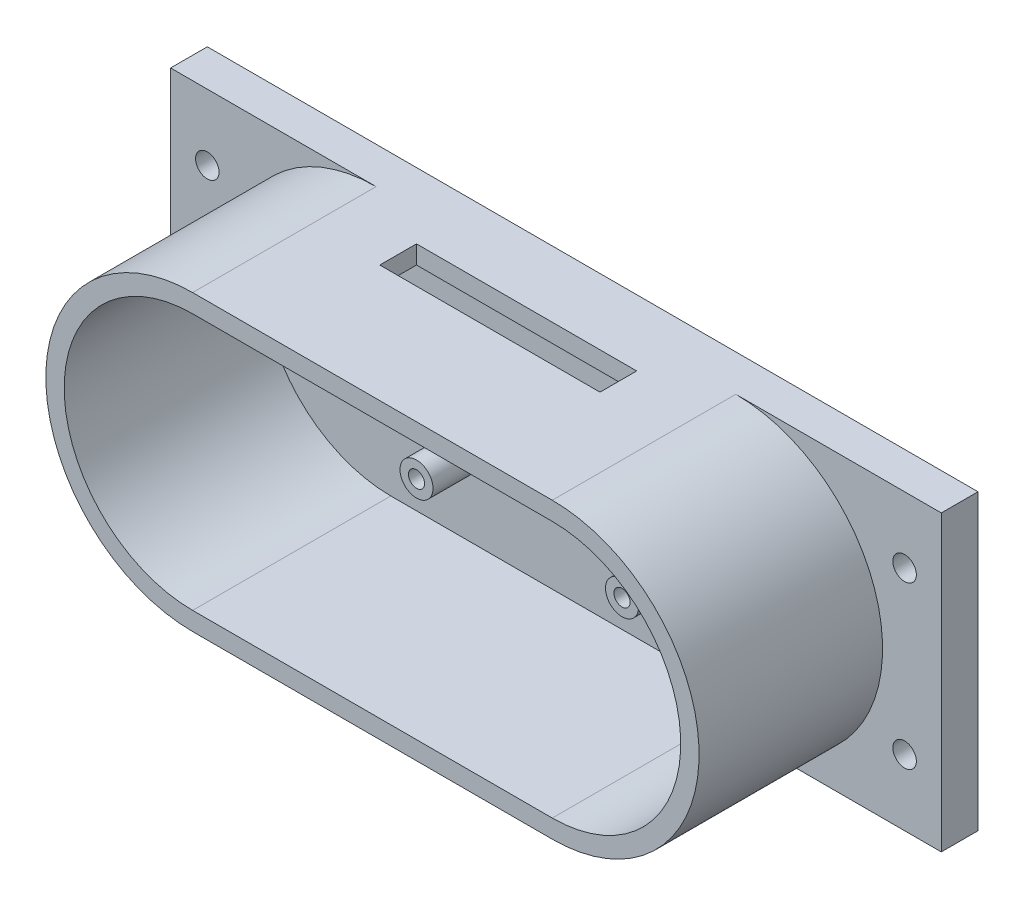
ISO-10303-21;
HEADER;
FILE_DESCRIPTION(('STEP AP214'),'2;1');
FILE_NAME('part.step','',(''),(''),'','','');
FILE_SCHEMA(('AUTOMOTIVE_DESIGN { 1 0 10303 214 1 1 1 1 }'));
ENDSEC;
DATA;
#1=APPLICATION_CONTEXT('core data for automotive mechanical design processes');
#2=APPLICATION_PROTOCOL_DEFINITION('international standard','automotive_design',2000,#1);
#3=PRODUCT_CONTEXT('',#1,'mechanical');
#4=PRODUCT('Part','Part','',(#3));
#5=PRODUCT_RELATED_PRODUCT_CATEGORY('part','',(#4));
#6=PRODUCT_DEFINITION_FORMATION('','',#4);
#7=PRODUCT_DEFINITION_CONTEXT('part definition',#1,'design');
#8=PRODUCT_DEFINITION('design','',#6,#7);
#9=PRODUCT_DEFINITION_SHAPE('','',#8);
#10=(LENGTH_UNIT() NAMED_UNIT(*) SI_UNIT(.MILLI.,.METRE.));
#11=(NAMED_UNIT(*) PLANE_ANGLE_UNIT() SI_UNIT($,.RADIAN.));
#12=(NAMED_UNIT(*) SI_UNIT($,.STERADIAN.) SOLID_ANGLE_UNIT());
#13=UNCERTAINTY_MEASURE_WITH_UNIT(LENGTH_MEASURE(1.E-05),#10,'distance_accuracy_value','');
#14=(GEOMETRIC_REPRESENTATION_CONTEXT(3) GLOBAL_UNCERTAINTY_ASSIGNED_CONTEXT((#13)) GLOBAL_UNIT_ASSIGNED_CONTEXT((#10,
#11,#12)) REPRESENTATION_CONTEXT('',''));
#15=CARTESIAN_POINT('',(0.,0.,0.));
#16=DIRECTION('',(0.,0.,1.));
#17=DIRECTION('',(1.,0.,0.));
#18=AXIS2_PLACEMENT_3D('',#15,#16,#17);
#19=CARTESIAN_POINT('',(24.5,-2.77555756156289E-13,29.9999999999998));
#20=DIRECTION('',(0.,0.,-1.));
#21=DIRECTION('',(-1.,0.,0.));
#22=AXIS2_PLACEMENT_3D('',#19,#20,#21);
#23=PLANE('',#22);
#24=CARTESIAN_POINT('',(24.5,-2.77555756156289E-13,29.9999999999998));
#25=DIRECTION('',(0.,0.,1.));
#26=DIRECTION('',(-1.,0.,0.));
#27=AXIS2_PLACEMENT_3D('',#24,#25,#26);
#28=CIRCLE('',#27,20.);
#29=CARTESIAN_POINT('',(24.5,-20.0000000000002,29.9999999999997));
#30=VERTEX_POINT('',#29);
#31=CARTESIAN_POINT('',(24.5,19.9999999999997,29.9999999999997));
#32=VERTEX_POINT('',#31);
#33=EDGE_CURVE('E296',#30,#32,#28,.T.);
#34=ORIENTED_EDGE('',*,*,#33,.T.);
#35=DIRECTION('',(-1.,0.,0.));
#36=VECTOR('',#35,1.);
#37=CARTESIAN_POINT('',(-24.4999999999999,19.9999999999996,30.));
#38=LINE('',#37,#36);
#39=CARTESIAN_POINT('',(-24.4999999999999,19.9999999999996,30.));
#40=VERTEX_POINT('',#39);
#41=EDGE_CURVE('E299',#32,#40,#38,.T.);
#42=ORIENTED_EDGE('',*,*,#41,.T.);
#43=CARTESIAN_POINT('',(-24.4999999999999,-4.44089209850063E-13,30.));
#44=DIRECTION('',(0.,0.,1.));
#45=DIRECTION('',(1.,0.,0.));
#46=AXIS2_PLACEMENT_3D('',#43,#44,#45);
#47=CIRCLE('',#46,20.);
#48=CARTESIAN_POINT('',(-24.4999999999999,-20.0000000000004,30.));
#49=VERTEX_POINT('',#48);
#50=EDGE_CURVE('E302',#40,#49,#47,.T.);
#51=ORIENTED_EDGE('',*,*,#50,.T.);
#52=DIRECTION('',(1.,0.,0.));
#53=VECTOR('',#52,1.);
#54=CARTESIAN_POINT('',(-24.4999999999999,-20.0000000000004,30.));
#55=LINE('',#54,#53);
#56=EDGE_CURVE('E304',#49,#30,#55,.T.);
#57=ORIENTED_EDGE('',*,*,#56,.T.);
#58=EDGE_LOOP('',(#34,#42,#51,#57));
#59=FACE_BOUND('',#58,.T.);
#60=CARTESIAN_POINT('',(24.5,-2.77555756156289E-13,29.9999999999998));
#61=DIRECTION('',(0.,0.,-1.));
#62=DIRECTION('',(-1.,0.,0.));
#63=AXIS2_PLACEMENT_3D('',#60,#61,#62);
#64=CIRCLE('',#63,17.5);
#65=CARTESIAN_POINT('',(24.5,-17.5000000000002,29.9999999999997));
#66=VERTEX_POINT('',#65);
#67=CARTESIAN_POINT('',(24.5,17.4999999999998,29.9999999999997));
#68=VERTEX_POINT('',#67);
#69=EDGE_CURVE('E288',#66,#68,#64,.F.);
#70=ORIENTED_EDGE('',*,*,#69,.F.);
#71=DIRECTION('',(1.,0.,0.));
#72=VECTOR('',#71,1.);
#73=CARTESIAN_POINT('',(24.5,-17.5000000000002,29.9999999999997));
#74=LINE('',#73,#72);
#75=CARTESIAN_POINT('',(-24.4999999999999,-17.5000000000004,30.));
#76=VERTEX_POINT('',#75);
#77=EDGE_CURVE('E278',#76,#66,#74,.T.);
#78=ORIENTED_EDGE('',*,*,#77,.F.);
#79=CARTESIAN_POINT('',(-24.4999999999999,-4.44089209850063E-13,30.));
#80=DIRECTION('',(0.,0.,-1.));
#81=DIRECTION('',(-1.,0.,0.));
#82=AXIS2_PLACEMENT_3D('',#79,#80,#81);
#83=CIRCLE('',#82,17.5);
#84=CARTESIAN_POINT('',(-24.4999999999999,17.4999999999996,30.));
#85=VERTEX_POINT('',#84);
#86=EDGE_CURVE('E292',#85,#76,#83,.F.);
#87=ORIENTED_EDGE('',*,*,#86,.F.);
#88=DIRECTION('',(-1.,0.,0.));
#89=VECTOR('',#88,1.);
#90=CARTESIAN_POINT('',(24.5,17.4999999999998,29.9999999999997));
#91=LINE('',#90,#89);
#92=EDGE_CURVE('E290',#68,#85,#91,.T.);
#93=ORIENTED_EDGE('',*,*,#92,.F.);
#94=EDGE_LOOP('',(#70,#78,#87,#93));
#95=FACE_BOUND('',#94,.T.);
#96=ADVANCED_FACE('F38',(#59,#95),#23,.F.);
#97=CARTESIAN_POINT('',(24.5,-2.77555756156289E-13,29.9999999999998));
#98=DIRECTION('',(0.,0.,-1.));
#99=DIRECTION('',(-1.,0.,0.));
#100=AXIS2_PLACEMENT_3D('',#97,#98,#99);
#101=CYLINDRICAL_SURFACE('',#100,20.);
#102=DIRECTION('',(0.,0.,-1.));
#103=VECTOR('',#102,1.);
#104=CARTESIAN_POINT('',(24.5,-20.0000000000002,29.9999999999997));
#105=LINE('',#104,#103);
#106=CARTESIAN_POINT('',(24.5,-20.,4.99999999999973));
#107=VERTEX_POINT('',#106);
#108=EDGE_CURVE('E306',#30,#107,#105,.T.);
#109=ORIENTED_EDGE('',*,*,#108,.T.);
#110=CARTESIAN_POINT('',(24.5,0.,4.99999999999978));
#111=DIRECTION('',(0.,0.,-1.));
#112=DIRECTION('',(1.,0.,0.));
#113=AXIS2_PLACEMENT_3D('',#110,#111,#112);
#114=CIRCLE('',#113,20.);
#115=CARTESIAN_POINT('',(24.5,20.,4.99999999999973));
#116=VERTEX_POINT('',#115);
#117=EDGE_CURVE('E227',#116,#107,#114,.T.);
#118=ORIENTED_EDGE('',*,*,#117,.F.);
#119=DIRECTION('',(0.,0.,-1.));
#120=VECTOR('',#119,1.);
#121=CARTESIAN_POINT('',(24.5,19.9999999999997,29.9999999999997));
#122=LINE('',#121,#120);
#123=EDGE_CURVE('E315',#32,#116,#122,.T.);
#124=ORIENTED_EDGE('',*,*,#123,.F.);
#125=ORIENTED_EDGE('',*,*,#33,.F.);
#126=EDGE_LOOP('',(#109,#118,#124,#125));
#127=FACE_BOUND('',#126,.T.);
#128=ADVANCED_FACE('F40',(#127),#101,.T.);
#129=CARTESIAN_POINT('',(-24.4999999999999,19.9999999999996,30.));
#130=DIRECTION('',(0.,-1.,0.));
#131=DIRECTION('',(1.,0.,0.));
#132=AXIS2_PLACEMENT_3D('',#129,#130,#131);
#133=PLANE('',#132);
#134=DIRECTION('',(-1.,0.,0.));
#135=VECTOR('',#134,1.);
#136=CARTESIAN_POINT('',(15.,20.,8.9999999999999));
#137=LINE('',#136,#135);
#138=CARTESIAN_POINT('',(15.,20.,8.9999999999999));
#139=VERTEX_POINT('',#138);
#140=CARTESIAN_POINT('',(-15.,20.,8.99999999999984));
#141=VERTEX_POINT('',#140);
#142=EDGE_CURVE('E162',#139,#141,#137,.T.);
#143=ORIENTED_EDGE('',*,*,#142,.F.);
#144=DIRECTION('',(0.,0.,-1.));
#145=VECTOR('',#144,1.);
#146=CARTESIAN_POINT('',(15.,19.9999999999998,13.9999999999999));
#147=LINE('',#146,#145);
#148=CARTESIAN_POINT('',(15.,19.9999999999998,13.9999999999999));
#149=VERTEX_POINT('',#148);
#150=EDGE_CURVE('E53',#149,#139,#147,.T.);
#151=ORIENTED_EDGE('',*,*,#150,.F.);
#152=DIRECTION('',(1.,0.,0.));
#153=VECTOR('',#152,1.);
#154=CARTESIAN_POINT('',(15.,19.9999999999998,13.9999999999999));
#155=LINE('',#154,#153);
#156=CARTESIAN_POINT('',(-15.,20.,13.9999999999998));
#157=VERTEX_POINT('',#156);
#158=EDGE_CURVE('E169',#157,#149,#155,.T.);
#159=ORIENTED_EDGE('',*,*,#158,.F.);
#160=DIRECTION('',(0.,0.,1.));
#161=VECTOR('',#160,1.);
#162=CARTESIAN_POINT('',(-15.,20.,13.9999999999998));
#163=LINE('',#162,#161);
#164=EDGE_CURVE('E153',#141,#157,#163,.T.);
#165=ORIENTED_EDGE('',*,*,#164,.F.);
#166=EDGE_LOOP('',(#143,#151,#159,#165));
#167=FACE_BOUND('',#166,.T.);
#168=DIRECTION('',(-1.,0.,0.));
#169=VECTOR('',#168,1.);
#170=CARTESIAN_POINT('',(-24.4999999999999,19.9999999999999,0.));
#171=LINE('',#170,#169);
#172=CARTESIAN_POINT('',(52.5,20.,0.));
#173=VERTEX_POINT('',#172);
#174=CARTESIAN_POINT('',(-52.4999999999999,19.9999999999999,-2.77555756156289E-13));
#175=VERTEX_POINT('',#174);
#176=EDGE_CURVE('E272',#173,#175,#171,.T.);
#177=ORIENTED_EDGE('',*,*,#176,.T.);
#178=DIRECTION('',(0.,0.,-1.));
#179=VECTOR('',#178,1.);
#180=CARTESIAN_POINT('',(-52.5,19.9999999999999,4.99999999999973));
#181=LINE('',#180,#179);
#182=CARTESIAN_POINT('',(-52.5,19.9999999999999,4.99999999999973));
#183=VERTEX_POINT('',#182);
#184=EDGE_CURVE('E262',#183,#175,#181,.T.);
#185=ORIENTED_EDGE('',*,*,#184,.F.);
#186=DIRECTION('',(-1.,0.,0.));
#187=VECTOR('',#186,1.);
#188=CARTESIAN_POINT('',(-24.5,20.,5.));
#189=LINE('',#188,#187);
#190=CARTESIAN_POINT('',(-24.5,20.,5.));
#191=VERTEX_POINT('',#190);
#192=EDGE_CURVE('E250',#191,#183,#189,.T.);
#193=ORIENTED_EDGE('',*,*,#192,.F.);
#194=DIRECTION('',(0.,0.,-1.));
#195=VECTOR('',#194,1.);
#196=CARTESIAN_POINT('',(-24.4999999999999,19.9999999999996,30.));
#197=LINE('',#196,#195);
#198=EDGE_CURVE('E313',#40,#191,#197,.T.);
#199=ORIENTED_EDGE('',*,*,#198,.F.);
#200=ORIENTED_EDGE('',*,*,#41,.F.);
#201=ORIENTED_EDGE('',*,*,#123,.T.);
#202=DIRECTION('',(-1.,0.,0.));
#203=VECTOR('',#202,1.);
#204=CARTESIAN_POINT('',(52.5,20.,5.));
#205=LINE('',#204,#203);
#206=CARTESIAN_POINT('',(52.5,20.,5.));
#207=VERTEX_POINT('',#206);
#208=EDGE_CURVE('E235',#207,#116,#205,.T.);
#209=ORIENTED_EDGE('',*,*,#208,.F.);
#210=DIRECTION('',(0.,0.,-1.));
#211=VECTOR('',#210,1.);
#212=CARTESIAN_POINT('',(52.5,20.,5.));
#213=LINE('',#212,#211);
#214=EDGE_CURVE('E238',#207,#173,#213,.T.);
#215=ORIENTED_EDGE('',*,*,#214,.T.);
#216=EDGE_LOOP('',(#177,#185,#193,#199,#200,#201,#209,#215));
#217=FACE_BOUND('',#216,.T.);
#218=ADVANCED_FACE('F166',(#167,#217),#133,.F.);
#219=CARTESIAN_POINT('',(-24.4999999999999,-4.44089209850063E-13,30.));
#220=DIRECTION('',(0.,0.,-1.));
#221=DIRECTION('',(-1.,0.,0.));
#222=AXIS2_PLACEMENT_3D('',#219,#220,#221);
#223=CYLINDRICAL_SURFACE('',#222,20.);
#224=ORIENTED_EDGE('',*,*,#198,.T.);
#225=CARTESIAN_POINT('',(-24.5,0.,5.));
#226=DIRECTION('',(0.,0.,-1.));
#227=DIRECTION('',(1.,0.,0.));
#228=AXIS2_PLACEMENT_3D('',#225,#226,#227);
#229=CIRCLE('',#228,20.);
#230=CARTESIAN_POINT('',(-24.5,-20.0000000000001,5.));
#231=VERTEX_POINT('',#230);
#232=EDGE_CURVE('E247',#231,#191,#229,.T.);
#233=ORIENTED_EDGE('',*,*,#232,.F.);
#234=DIRECTION('',(0.,0.,-1.));
#235=VECTOR('',#234,1.);
#236=CARTESIAN_POINT('',(-24.4999999999999,-20.0000000000004,30.));
#237=LINE('',#236,#235);
#238=EDGE_CURVE('E310',#49,#231,#237,.T.);
#239=ORIENTED_EDGE('',*,*,#238,.F.);
#240=ORIENTED_EDGE('',*,*,#50,.F.);
#241=EDGE_LOOP('',(#224,#233,#239,#240));
#242=FACE_BOUND('',#241,.T.);
#243=ADVANCED_FACE('F386',(#242),#223,.T.);
#244=CARTESIAN_POINT('',(-24.4999999999999,-20.0000000000004,30.));
#245=DIRECTION('',(0.,1.,0.));
#246=DIRECTION('',(-1.,0.,0.));
#247=AXIS2_PLACEMENT_3D('',#244,#245,#246);
#248=PLANE('',#247);
#249=DIRECTION('',(1.,0.,0.));
#250=VECTOR('',#249,1.);
#251=CARTESIAN_POINT('',(-24.5,-20.0000000000002,0.));
#252=LINE('',#251,#250);
#253=CARTESIAN_POINT('',(-52.5,-20.0000000000002,-2.77555756156289E-13));
#254=VERTEX_POINT('',#253);
#255=CARTESIAN_POINT('',(52.5,-20.,0.));
#256=VERTEX_POINT('',#255);
#257=EDGE_CURVE('E300',#254,#256,#252,.T.);
#258=ORIENTED_EDGE('',*,*,#257,.T.);
#259=DIRECTION('',(0.,0.,-1.));
#260=VECTOR('',#259,1.);
#261=CARTESIAN_POINT('',(52.5,-20.,5.));
#262=LINE('',#261,#260);
#263=CARTESIAN_POINT('',(52.5,-20.,5.));
#264=VERTEX_POINT('',#263);
#265=EDGE_CURVE('E243',#264,#256,#262,.T.);
#266=ORIENTED_EDGE('',*,*,#265,.F.);
#267=DIRECTION('',(1.,0.,0.));
#268=VECTOR('',#267,1.);
#269=CARTESIAN_POINT('',(24.5,-20.,4.99999999999973));
#270=LINE('',#269,#268);
#271=EDGE_CURVE('E230',#107,#264,#270,.T.);
#272=ORIENTED_EDGE('',*,*,#271,.F.);
#273=ORIENTED_EDGE('',*,*,#108,.F.);
#274=ORIENTED_EDGE('',*,*,#56,.F.);
#275=ORIENTED_EDGE('',*,*,#238,.T.);
#276=DIRECTION('',(1.,0.,0.));
#277=VECTOR('',#276,1.);
#278=CARTESIAN_POINT('',(-52.5,-20.0000000000002,4.99999999999973));
#279=LINE('',#278,#277);
#280=CARTESIAN_POINT('',(-52.5,-20.0000000000002,4.99999999999973));
#281=VERTEX_POINT('',#280);
#282=EDGE_CURVE('E254',#281,#231,#279,.T.);
#283=ORIENTED_EDGE('',*,*,#282,.F.);
#284=DIRECTION('',(0.,0.,-1.));
#285=VECTOR('',#284,1.);
#286=CARTESIAN_POINT('',(-52.5,-20.0000000000002,4.99999999999973));
#287=LINE('',#286,#285);
#288=EDGE_CURVE('E257',#281,#254,#287,.T.);
#289=ORIENTED_EDGE('',*,*,#288,.T.);
#290=EDGE_LOOP('',(#258,#266,#272,#273,#274,#275,#283,#289));
#291=FACE_BOUND('',#290,.T.);
#292=ADVANCED_FACE('F382',(#291),#248,.F.);
#293=CARTESIAN_POINT('',(24.5,0.,-2.22044604925031E-13));
#294=DIRECTION('',(0.,0.,-1.));
#295=DIRECTION('',(-1.,0.,0.));
#296=AXIS2_PLACEMENT_3D('',#293,#294,#295);
#297=PLANE('',#296);
#298=CARTESIAN_POINT('',(-14.,6.74999999999987,0.));
#299=DIRECTION('',(0.,0.,-1.));
#300=DIRECTION('',(-1.,0.,0.));
#301=AXIS2_PLACEMENT_3D('',#298,#299,#300);
#302=CIRCLE('',#301,1.1);
#303=CARTESIAN_POINT('',(-15.1,6.74999999999987,0.));
#304=VERTEX_POINT('',#303);
#305=EDGE_CURVE('E181',#304,#304,#302,.T.);
#306=ORIENTED_EDGE('',*,*,#305,.F.);
#307=EDGE_LOOP('',(#306));
#308=FACE_BOUND('',#307,.T.);
#309=CARTESIAN_POINT('',(14.,6.75000000000003,-2.22044604925031E-13));
#310=DIRECTION('',(0.,0.,-1.));
#311=DIRECTION('',(-1.,0.,0.));
#312=AXIS2_PLACEMENT_3D('',#309,#310,#311);
#313=CIRCLE('',#312,1.1);
#314=CARTESIAN_POINT('',(12.9,6.75000000000003,-2.22044604925031E-13));
#315=VERTEX_POINT('',#314);
#316=EDGE_CURVE('E185',#315,#315,#313,.T.);
#317=ORIENTED_EDGE('',*,*,#316,.F.);
#318=EDGE_LOOP('',(#317));
#319=FACE_BOUND('',#318,.T.);
#320=CARTESIAN_POINT('',(14.0000000000001,-6.75000000000003,-2.22044604925031E-13));
#321=DIRECTION('',(0.,0.,-1.));
#322=DIRECTION('',(-1.,0.,0.));
#323=AXIS2_PLACEMENT_3D('',#320,#321,#322);
#324=CIRCLE('',#323,1.1);
#325=CARTESIAN_POINT('',(12.9000000000001,-6.75000000000003,-2.22044604925031E-13));
#326=VERTEX_POINT('',#325);
#327=EDGE_CURVE('E189',#326,#326,#324,.T.);
#328=ORIENTED_EDGE('',*,*,#327,.F.);
#329=EDGE_LOOP('',(#328));
#330=FACE_BOUND('',#329,.T.);
#331=CARTESIAN_POINT('',(-14.0000000000001,-6.7500000000002,0.));
#332=DIRECTION('',(0.,0.,-1.));
#333=DIRECTION('',(-1.,0.,0.));
#334=AXIS2_PLACEMENT_3D('',#331,#332,#333);
#335=CIRCLE('',#334,1.1);
#336=CARTESIAN_POINT('',(-15.1000000000001,-6.7500000000002,0.));
#337=VERTEX_POINT('',#336);
#338=EDGE_CURVE('E193',#337,#337,#335,.T.);
#339=ORIENTED_EDGE('',*,*,#338,.F.);
#340=EDGE_LOOP('',(#339));
#341=FACE_BOUND('',#340,.T.);
#342=CARTESIAN_POINT('',(-47.4999999999999,10.9999999999998,0.));
#343=DIRECTION('',(0.,0.,1.));
#344=DIRECTION('',(1.,0.,0.));
#345=AXIS2_PLACEMENT_3D('',#342,#343,#344);
#346=CIRCLE('',#345,1.59999999999999);
#347=CARTESIAN_POINT('',(-45.8999999999999,10.9999999999998,0.));
#348=VERTEX_POINT('',#347);
#349=EDGE_CURVE('E207',#348,#348,#346,.T.);
#350=ORIENTED_EDGE('',*,*,#349,.T.);
#351=EDGE_LOOP('',(#350));
#352=FACE_BOUND('',#351,.T.);
#353=CARTESIAN_POINT('',(-47.4999999999999,-11.0000000000002,0.));
#354=DIRECTION('',(0.,0.,1.));
#355=DIRECTION('',(1.,0.,0.));
#356=AXIS2_PLACEMENT_3D('',#353,#354,#355);
#357=CIRCLE('',#356,1.59999999999999);
#358=CARTESIAN_POINT('',(-45.8999999999999,-11.0000000000002,0.));
#359=VERTEX_POINT('',#358);
#360=EDGE_CURVE('E213',#359,#359,#357,.T.);
#361=ORIENTED_EDGE('',*,*,#360,.T.);
#362=EDGE_LOOP('',(#361));
#363=FACE_BOUND('',#362,.T.);
#364=CARTESIAN_POINT('',(47.4999999999999,-11.,0.));
#365=DIRECTION('',(0.,0.,1.));
#366=DIRECTION('',(1.,0.,0.));
#367=AXIS2_PLACEMENT_3D('',#364,#365,#366);
#368=CIRCLE('',#367,1.59999999999999);
#369=CARTESIAN_POINT('',(49.0999999999999,-11.,0.));
#370=VERTEX_POINT('',#369);
#371=EDGE_CURVE('E219',#370,#370,#368,.T.);
#372=ORIENTED_EDGE('',*,*,#371,.T.);
#373=EDGE_LOOP('',(#372));
#374=FACE_BOUND('',#373,.T.);
#375=CARTESIAN_POINT('',(47.4999999999999,11.,0.));
#376=DIRECTION('',(0.,0.,1.));
#377=DIRECTION('',(1.,0.,0.));
#378=AXIS2_PLACEMENT_3D('',#375,#376,#377);
#379=CIRCLE('',#378,1.59999999999999);
#380=CARTESIAN_POINT('',(49.0999999999999,11.,0.));
#381=VERTEX_POINT('',#380);
#382=EDGE_CURVE('E223',#381,#381,#379,.T.);
#383=ORIENTED_EDGE('',*,*,#382,.T.);
#384=EDGE_LOOP('',(#383));
#385=FACE_BOUND('',#384,.T.);
#386=ORIENTED_EDGE('',*,*,#176,.F.);
#387=DIRECTION('',(0.,1.,0.));
#388=VECTOR('',#387,1.);
#389=CARTESIAN_POINT('',(52.5,-20.,0.));
#390=LINE('',#389,#388);
#391=EDGE_CURVE('E231',#256,#173,#390,.T.);
#392=ORIENTED_EDGE('',*,*,#391,.F.);
#393=ORIENTED_EDGE('',*,*,#257,.F.);
#394=DIRECTION('',(0.,-1.,0.));
#395=VECTOR('',#394,1.);
#396=CARTESIAN_POINT('',(-52.4999999999999,19.9999999999999,-2.77555756156289E-13));
#397=LINE('',#396,#395);
#398=EDGE_CURVE('E246',#175,#254,#397,.T.);
#399=ORIENTED_EDGE('',*,*,#398,.F.);
#400=EDGE_LOOP('',(#386,#392,#393,#399));
#401=FACE_BOUND('',#400,.T.);
#402=ADVANCED_FACE('F378',(#308,#319,#330,#341,#352,#363,#374,#385,#401),#297,.T.);
#403=CARTESIAN_POINT('',(24.5,-2.77555756156289E-13,29.9999999999998));
#404=DIRECTION('',(0.,0.,-1.));
#405=DIRECTION('',(-1.,0.,0.));
#406=AXIS2_PLACEMENT_3D('',#403,#404,#405);
#407=CYLINDRICAL_SURFACE('',#406,17.5);
#408=CARTESIAN_POINT('',(24.5,0.,2.99999999999978));
#409=DIRECTION('',(0.,0.,-1.));
#410=DIRECTION('',(-1.,0.,0.));
#411=AXIS2_PLACEMENT_3D('',#408,#409,#410);
#412=CIRCLE('',#411,17.5);
#413=CARTESIAN_POINT('',(24.5,-17.5,2.99999999999984));
#414=VERTEX_POINT('',#413);
#415=CARTESIAN_POINT('',(24.5,17.5,2.99999999999973));
#416=VERTEX_POINT('',#415);
#417=EDGE_CURVE('E265',#414,#416,#412,.F.);
#418=ORIENTED_EDGE('',*,*,#417,.F.);
#419=DIRECTION('',(0.,0.,-1.));
#420=VECTOR('',#419,1.);
#421=CARTESIAN_POINT('',(24.5,-17.5000000000002,29.9999999999997));
#422=LINE('',#421,#420);
#423=EDGE_CURVE('E274',#66,#414,#422,.T.);
#424=ORIENTED_EDGE('',*,*,#423,.F.);
#425=ORIENTED_EDGE('',*,*,#69,.T.);
#426=DIRECTION('',(0.,0.,1.));
#427=VECTOR('',#426,1.);
#428=CARTESIAN_POINT('',(24.5,17.4999999999998,29.9999999999997));
#429=LINE('',#428,#427);
#430=EDGE_CURVE('E269',#68,#416,#429,.F.);
#431=ORIENTED_EDGE('',*,*,#430,.T.);
#432=EDGE_LOOP('',(#418,#424,#425,#431));
#433=FACE_BOUND('',#432,.T.);
#434=ADVANCED_FACE('F381',(#433),#407,.F.);
#435=CARTESIAN_POINT('',(-24.4999999999999,17.4999999999996,30.));
#436=DIRECTION('',(0.,-1.,0.));
#437=DIRECTION('',(1.,0.,0.));
#438=AXIS2_PLACEMENT_3D('',#435,#436,#437);
#439=PLANE('',#438);
#440=DIRECTION('',(0.,0.,1.));
#441=VECTOR('',#440,1.);
#442=CARTESIAN_POINT('',(14.9999999999999,17.4999999999998,29.9999999999998));
#443=LINE('',#442,#441);
#444=CARTESIAN_POINT('',(15.,17.5000000000001,8.99999999999979));
#445=VERTEX_POINT('',#444);
#446=CARTESIAN_POINT('',(15.,17.4999999999999,13.9999999999998));
#447=VERTEX_POINT('',#446);
#448=EDGE_CURVE('E11',#445,#447,#443,.T.);
#449=ORIENTED_EDGE('',*,*,#448,.F.);
#450=DIRECTION('',(1.,0.,0.));
#451=VECTOR('',#450,1.);
#452=CARTESIAN_POINT('',(-24.5,17.4999999999999,9.00000000000001));
#453=LINE('',#452,#451);
#454=CARTESIAN_POINT('',(-15.,17.4999999999999,8.99999999999984));
#455=VERTEX_POINT('',#454);
#456=EDGE_CURVE('E335',#455,#445,#453,.T.);
#457=ORIENTED_EDGE('',*,*,#456,.F.);
#458=DIRECTION('',(0.,0.,-1.));
#459=VECTOR('',#458,1.);
#460=CARTESIAN_POINT('',(-15.0000000000001,17.4999999999996,29.9999999999999));
#461=LINE('',#460,#459);
#462=CARTESIAN_POINT('',(-15.,17.5,13.9999999999998));
#463=VERTEX_POINT('',#462);
#464=EDGE_CURVE('E156',#463,#455,#461,.T.);
#465=ORIENTED_EDGE('',*,*,#464,.F.);
#466=DIRECTION('',(-1.,0.,0.));
#467=VECTOR('',#466,1.);
#468=CARTESIAN_POINT('',(-24.5,17.5,14.));
#469=LINE('',#468,#467);
#470=EDGE_CURVE('E46',#447,#463,#469,.T.);
#471=ORIENTED_EDGE('',*,*,#470,.F.);
#472=EDGE_LOOP('',(#449,#457,#465,#471));
#473=FACE_BOUND('',#472,.T.);
#474=DIRECTION('',(-1.,0.,0.));
#475=VECTOR('',#474,1.);
#476=CARTESIAN_POINT('',(24.5,17.5,2.99999999999973));
#477=LINE('',#476,#475);
#478=CARTESIAN_POINT('',(-24.4999999999999,17.4999999999999,3.));
#479=VERTEX_POINT('',#478);
#480=EDGE_CURVE('E268',#416,#479,#477,.T.);
#481=ORIENTED_EDGE('',*,*,#480,.F.);
#482=ORIENTED_EDGE('',*,*,#430,.F.);
#483=ORIENTED_EDGE('',*,*,#92,.T.);
#484=DIRECTION('',(0.,0.,-1.));
#485=VECTOR('',#484,1.);
#486=CARTESIAN_POINT('',(-24.4999999999999,17.4999999999996,30.));
#487=LINE('',#486,#485);
#488=EDGE_CURVE('E273',#85,#479,#487,.T.);
#489=ORIENTED_EDGE('',*,*,#488,.T.);
#490=EDGE_LOOP('',(#481,#482,#483,#489));
#491=FACE_BOUND('',#490,.T.);
#492=ADVANCED_FACE('F351',(#473,#491),#439,.T.);
#493=CARTESIAN_POINT('',(-24.4999999999999,-4.44089209850063E-13,30.));
#494=DIRECTION('',(0.,0.,-1.));
#495=DIRECTION('',(-1.,0.,0.));
#496=AXIS2_PLACEMENT_3D('',#493,#494,#495);
#497=CYLINDRICAL_SURFACE('',#496,17.5);
#498=CARTESIAN_POINT('',(-24.5,0.,3.));
#499=DIRECTION('',(0.,0.,-1.));
#500=DIRECTION('',(-1.,0.,0.));
#501=AXIS2_PLACEMENT_3D('',#498,#499,#500);
#502=CIRCLE('',#501,17.5);
#503=CARTESIAN_POINT('',(-24.5,-17.5,3.));
#504=VERTEX_POINT('',#503);
#505=EDGE_CURVE('E280',#479,#504,#502,.F.);
#506=ORIENTED_EDGE('',*,*,#505,.F.);
#507=ORIENTED_EDGE('',*,*,#488,.F.);
#508=ORIENTED_EDGE('',*,*,#86,.T.);
#509=DIRECTION('',(0.,0.,1.));
#510=VECTOR('',#509,1.);
#511=CARTESIAN_POINT('',(-24.4999999999999,-17.5000000000004,30.));
#512=LINE('',#511,#510);
#513=EDGE_CURVE('E277',#76,#504,#512,.F.);
#514=ORIENTED_EDGE('',*,*,#513,.T.);
#515=EDGE_LOOP('',(#506,#507,#508,#514));
#516=FACE_BOUND('',#515,.T.);
#517=ADVANCED_FACE('F420',(#516),#497,.F.);
#518=CARTESIAN_POINT('',(-24.4999999999999,-17.5000000000004,30.));
#519=DIRECTION('',(0.,1.,0.));
#520=DIRECTION('',(-1.,0.,0.));
#521=AXIS2_PLACEMENT_3D('',#518,#519,#520);
#522=PLANE('',#521);
#523=DIRECTION('',(1.,0.,0.));
#524=VECTOR('',#523,1.);
#525=CARTESIAN_POINT('',(24.5,-17.5,2.99999999999984));
#526=LINE('',#525,#524);
#527=EDGE_CURVE('E284',#504,#414,#526,.T.);
#528=ORIENTED_EDGE('',*,*,#527,.F.);
#529=ORIENTED_EDGE('',*,*,#513,.F.);
#530=ORIENTED_EDGE('',*,*,#77,.T.);
#531=ORIENTED_EDGE('',*,*,#423,.T.);
#532=EDGE_LOOP('',(#528,#529,#530,#531));
#533=FACE_BOUND('',#532,.T.);
#534=ADVANCED_FACE('F427',(#533),#522,.T.);
#535=CARTESIAN_POINT('',(24.5,0.,2.99999999999978));
#536=DIRECTION('',(0.,0.,-1.));
#537=DIRECTION('',(-1.,0.,0.));
#538=AXIS2_PLACEMENT_3D('',#535,#536,#537);
#539=PLANE('',#538);
#540=CARTESIAN_POINT('',(14.0000000000001,-6.75000000000003,2.99999999999978));
#541=DIRECTION('',(0.,0.,-1.));
#542=DIRECTION('',(-1.,0.,0.));
#543=AXIS2_PLACEMENT_3D('',#540,#541,#542);
#544=CIRCLE('',#543,2.25);
#545=CARTESIAN_POINT('',(11.7500000000001,-6.75000000000003,2.99999999999978));
#546=VERTEX_POINT('',#545);
#547=EDGE_CURVE('E332',#546,#546,#544,.F.);
#548=ORIENTED_EDGE('',*,*,#547,.F.);
#549=EDGE_LOOP('',(#548));
#550=FACE_BOUND('',#549,.T.);
#551=CARTESIAN_POINT('',(-14.0000000000001,-6.75000000000009,3.));
#552=DIRECTION('',(0.,0.,-1.));
#553=DIRECTION('',(-1.,0.,0.));
#554=AXIS2_PLACEMENT_3D('',#551,#552,#553);
#555=CIRCLE('',#554,2.25);
#556=CARTESIAN_POINT('',(-16.2500000000001,-6.75000000000009,3.));
#557=VERTEX_POINT('',#556);
#558=EDGE_CURVE('E329',#557,#557,#555,.F.);
#559=ORIENTED_EDGE('',*,*,#558,.F.);
#560=EDGE_LOOP('',(#559));
#561=FACE_BOUND('',#560,.T.);
#562=CARTESIAN_POINT('',(14.0000000000001,6.75000000000003,2.99999999999978));
#563=DIRECTION('',(0.,0.,-1.));
#564=DIRECTION('',(-1.,0.,0.));
#565=AXIS2_PLACEMENT_3D('',#562,#563,#564);
#566=CIRCLE('',#565,2.25);
#567=CARTESIAN_POINT('',(11.7500000000001,6.75000000000003,2.99999999999978));
#568=VERTEX_POINT('',#567);
#569=EDGE_CURVE('E326',#568,#568,#566,.F.);
#570=ORIENTED_EDGE('',*,*,#569,.F.);
#571=EDGE_LOOP('',(#570));
#572=FACE_BOUND('',#571,.T.);
#573=CARTESIAN_POINT('',(-14.0000000000001,6.74999999999998,3.));
#574=DIRECTION('',(0.,0.,-1.));
#575=DIRECTION('',(-1.,0.,0.));
#576=AXIS2_PLACEMENT_3D('',#573,#574,#575);
#577=CIRCLE('',#576,2.25);
#578=CARTESIAN_POINT('',(-16.2500000000001,6.74999999999998,3.));
#579=VERTEX_POINT('',#578);
#580=EDGE_CURVE('E318',#579,#579,#577,.F.);
#581=ORIENTED_EDGE('',*,*,#580,.F.);
#582=EDGE_LOOP('',(#581));
#583=FACE_BOUND('',#582,.T.);
#584=ORIENTED_EDGE('',*,*,#417,.T.);
#585=ORIENTED_EDGE('',*,*,#480,.T.);
#586=ORIENTED_EDGE('',*,*,#505,.T.);
#587=ORIENTED_EDGE('',*,*,#527,.T.);
#588=EDGE_LOOP('',(#584,#585,#586,#587));
#589=FACE_BOUND('',#588,.T.);
#590=ADVANCED_FACE('F376',(#550,#561,#572,#583,#589),#539,.F.);
#591=CARTESIAN_POINT('',(-52.5,19.9999999999999,4.99999999999973));
#592=DIRECTION('',(1.,0.,0.));
#593=DIRECTION('',(0.,1.,0.));
#594=AXIS2_PLACEMENT_3D('',#591,#592,#593);
#595=PLANE('',#594);
#596=ORIENTED_EDGE('',*,*,#398,.T.);
#597=ORIENTED_EDGE('',*,*,#288,.F.);
#598=DIRECTION('',(0.,-1.,0.));
#599=VECTOR('',#598,1.);
#600=CARTESIAN_POINT('',(-52.5,19.9999999999999,4.99999999999973));
#601=LINE('',#600,#599);
#602=EDGE_CURVE('E252',#183,#281,#601,.T.);
#603=ORIENTED_EDGE('',*,*,#602,.F.);
#604=ORIENTED_EDGE('',*,*,#184,.T.);
#605=EDGE_LOOP('',(#596,#597,#603,#604));
#606=FACE_BOUND('',#605,.T.);
#607=ADVANCED_FACE('F441',(#606),#595,.F.);
#608=CARTESIAN_POINT('',(-24.5,0.,5.));
#609=DIRECTION('',(0.,0.,1.));
#610=DIRECTION('',(1.,0.,0.));
#611=AXIS2_PLACEMENT_3D('',#608,#609,#610);
#612=PLANE('',#611);
#613=CARTESIAN_POINT('',(-47.5000000000002,11.,4.99999999999989));
#614=DIRECTION('',(0.,0.,1.));
#615=DIRECTION('',(1.,0.,0.));
#616=AXIS2_PLACEMENT_3D('',#613,#614,#615);
#617=CIRCLE('',#616,1.59999999999999);
#618=CARTESIAN_POINT('',(-45.9000000000002,11.,4.99999999999989));
#619=VERTEX_POINT('',#618);
#620=EDGE_CURVE('E210',#619,#619,#617,.T.);
#621=ORIENTED_EDGE('',*,*,#620,.F.);
#622=EDGE_LOOP('',(#621));
#623=FACE_BOUND('',#622,.T.);
#624=CARTESIAN_POINT('',(-47.5000000000002,-11.0000000000001,5.));
#625=DIRECTION('',(0.,0.,1.));
#626=DIRECTION('',(1.,0.,0.));
#627=AXIS2_PLACEMENT_3D('',#624,#625,#626);
#628=CIRCLE('',#627,1.59999999999999);
#629=CARTESIAN_POINT('',(-45.9000000000002,-11.0000000000001,5.));
#630=VERTEX_POINT('',#629);
#631=EDGE_CURVE('E216',#630,#630,#628,.T.);
#632=ORIENTED_EDGE('',*,*,#631,.F.);
#633=EDGE_LOOP('',(#632));
#634=FACE_BOUND('',#633,.T.);
#635=ORIENTED_EDGE('',*,*,#232,.T.);
#636=ORIENTED_EDGE('',*,*,#192,.T.);
#637=ORIENTED_EDGE('',*,*,#602,.T.);
#638=ORIENTED_EDGE('',*,*,#282,.T.);
#639=EDGE_LOOP('',(#635,#636,#637,#638));
#640=FACE_BOUND('',#639,.T.);
#641=ADVANCED_FACE('F446',(#623,#634,#640),#612,.T.);
#642=CARTESIAN_POINT('',(52.5,-20.,5.));
#643=DIRECTION('',(-1.,0.,0.));
#644=DIRECTION('',(0.,0.,1.));
#645=AXIS2_PLACEMENT_3D('',#642,#643,#644);
#646=PLANE('',#645);
#647=ORIENTED_EDGE('',*,*,#391,.T.);
#648=ORIENTED_EDGE('',*,*,#214,.F.);
#649=DIRECTION('',(0.,1.,0.));
#650=VECTOR('',#649,1.);
#651=CARTESIAN_POINT('',(52.5,-20.,5.));
#652=LINE('',#651,#650);
#653=EDGE_CURVE('E233',#264,#207,#652,.T.);
#654=ORIENTED_EDGE('',*,*,#653,.F.);
#655=ORIENTED_EDGE('',*,*,#265,.T.);
#656=EDGE_LOOP('',(#647,#648,#654,#655));
#657=FACE_BOUND('',#656,.T.);
#658=ADVANCED_FACE('F454',(#657),#646,.F.);
#659=CARTESIAN_POINT('',(24.5,0.,4.99999999999978));
#660=DIRECTION('',(0.,0.,1.));
#661=DIRECTION('',(1.,0.,0.));
#662=AXIS2_PLACEMENT_3D('',#659,#660,#661);
#663=PLANE('',#662);
#664=CARTESIAN_POINT('',(47.4999999999999,-11.,5.));
#665=DIRECTION('',(0.,0.,1.));
#666=DIRECTION('',(1.,0.,0.));
#667=AXIS2_PLACEMENT_3D('',#664,#665,#666);
#668=CIRCLE('',#667,1.59999999999999);
#669=CARTESIAN_POINT('',(49.0999999999999,-11.,5.));
#670=VERTEX_POINT('',#669);
#671=EDGE_CURVE('E222',#670,#670,#668,.T.);
#672=ORIENTED_EDGE('',*,*,#671,.F.);
#673=EDGE_LOOP('',(#672));
#674=FACE_BOUND('',#673,.T.);
#675=CARTESIAN_POINT('',(47.4999999999999,11.,5.));
#676=DIRECTION('',(0.,0.,1.));
#677=DIRECTION('',(1.,0.,0.));
#678=AXIS2_PLACEMENT_3D('',#675,#676,#677);
#679=CIRCLE('',#678,1.59999999999999);
#680=CARTESIAN_POINT('',(49.0999999999999,11.,5.));
#681=VERTEX_POINT('',#680);
#682=EDGE_CURVE('E226',#681,#681,#679,.T.);
#683=ORIENTED_EDGE('',*,*,#682,.F.);
#684=EDGE_LOOP('',(#683));
#685=FACE_BOUND('',#684,.T.);
#686=ORIENTED_EDGE('',*,*,#117,.T.);
#687=ORIENTED_EDGE('',*,*,#271,.T.);
#688=ORIENTED_EDGE('',*,*,#653,.T.);
#689=ORIENTED_EDGE('',*,*,#208,.T.);
#690=EDGE_LOOP('',(#686,#687,#688,#689));
#691=FACE_BOUND('',#690,.T.);
#692=ADVANCED_FACE('F462',(#674,#685,#691),#663,.T.);
#693=CARTESIAN_POINT('',(47.4999999999999,10.9999999999997,29.9999999999999));
#694=DIRECTION('',(0.,0.,1.));
#695=DIRECTION('',(1.,0.,0.));
#696=AXIS2_PLACEMENT_3D('',#693,#694,#695);
#697=CYLINDRICAL_SURFACE('',#696,1.59999999999999);
#698=ORIENTED_EDGE('',*,*,#682,.T.);
#699=EDGE_LOOP('',(#698));
#700=FACE_BOUND('',#699,.T.);
#701=ORIENTED_EDGE('',*,*,#382,.F.);
#702=EDGE_LOOP('',(#701));
#703=FACE_BOUND('',#702,.T.);
#704=ADVANCED_FACE('F470',(#700,#703),#697,.F.);
#705=CARTESIAN_POINT('',(47.4999999999999,-11.0000000000002,29.9999999999999));
#706=DIRECTION('',(0.,0.,1.));
#707=DIRECTION('',(1.,0.,0.));
#708=AXIS2_PLACEMENT_3D('',#705,#706,#707);
#709=CYLINDRICAL_SURFACE('',#708,1.59999999999999);
#710=ORIENTED_EDGE('',*,*,#671,.T.);
#711=EDGE_LOOP('',(#710));
#712=FACE_BOUND('',#711,.T.);
#713=ORIENTED_EDGE('',*,*,#371,.F.);
#714=EDGE_LOOP('',(#713));
#715=FACE_BOUND('',#714,.T.);
#716=ADVANCED_FACE('F478',(#712,#715),#709,.F.);
#717=CARTESIAN_POINT('',(-47.5,-11.0000000000003,29.9999999999999));
#718=DIRECTION('',(0.,0.,1.));
#719=DIRECTION('',(1.,0.,0.));
#720=AXIS2_PLACEMENT_3D('',#717,#718,#719);
#721=CYLINDRICAL_SURFACE('',#720,1.59999999999999);
#722=ORIENTED_EDGE('',*,*,#631,.T.);
#723=EDGE_LOOP('',(#722));
#724=FACE_BOUND('',#723,.T.);
#725=ORIENTED_EDGE('',*,*,#360,.F.);
#726=EDGE_LOOP('',(#725));
#727=FACE_BOUND('',#726,.T.);
#728=ADVANCED_FACE('F486',(#724,#727),#721,.F.);
#729=CARTESIAN_POINT('',(-47.5,10.9999999999997,29.9999999999999));
#730=DIRECTION('',(0.,0.,1.));
#731=DIRECTION('',(1.,0.,0.));
#732=AXIS2_PLACEMENT_3D('',#729,#730,#731);
#733=CYLINDRICAL_SURFACE('',#732,1.59999999999999);
#734=ORIENTED_EDGE('',*,*,#620,.T.);
#735=EDGE_LOOP('',(#734));
#736=FACE_BOUND('',#735,.T.);
#737=ORIENTED_EDGE('',*,*,#349,.F.);
#738=EDGE_LOOP('',(#737));
#739=FACE_BOUND('',#738,.T.);
#740=ADVANCED_FACE('F494',(#736,#739),#733,.F.);
#741=CARTESIAN_POINT('',(-14.0000000000001,6.74999999999998,10.));
#742=DIRECTION('',(0.,0.,-1.));
#743=DIRECTION('',(-1.,0.,0.));
#744=AXIS2_PLACEMENT_3D('',#741,#742,#743);
#745=CYLINDRICAL_SURFACE('',#744,2.25);
#746=CARTESIAN_POINT('',(-14.0000000000001,6.74999999999998,10.));
#747=DIRECTION('',(0.,0.,1.));
#748=DIRECTION('',(1.,0.,0.));
#749=AXIS2_PLACEMENT_3D('',#746,#747,#748);
#750=CIRCLE('',#749,2.25);
#751=CARTESIAN_POINT('',(-11.7500000000001,6.74999999999998,10.));
#752=VERTEX_POINT('',#751);
#753=EDGE_CURVE('E203',#752,#752,#750,.T.);
#754=ORIENTED_EDGE('',*,*,#753,.F.);
#755=EDGE_LOOP('',(#754));
#756=FACE_BOUND('',#755,.T.);
#757=ORIENTED_EDGE('',*,*,#580,.T.);
#758=EDGE_LOOP('',(#757));
#759=FACE_BOUND('',#758,.T.);
#760=ADVANCED_FACE('F502',(#756,#759),#745,.T.);
#761=CARTESIAN_POINT('',(-14.0000000000001,6.74999999999998,10.));
#762=DIRECTION('',(0.,0.,1.));
#763=DIRECTION('',(1.,0.,0.));
#764=AXIS2_PLACEMENT_3D('',#761,#762,#763);
#765=PLANE('',#764);
#766=CARTESIAN_POINT('',(-14.0000000000001,6.74999999999998,10.));
#767=DIRECTION('',(0.,0.,1.));
#768=DIRECTION('',(1.,0.,0.));
#769=AXIS2_PLACEMENT_3D('',#766,#767,#768);
#770=CIRCLE('',#769,1.1);
#771=CARTESIAN_POINT('',(-12.9000000000001,6.74999999999998,10.));
#772=VERTEX_POINT('',#771);
#773=EDGE_CURVE('E176',#772,#772,#770,.T.);
#774=ORIENTED_EDGE('',*,*,#773,.F.);
#775=EDGE_LOOP('',(#774));
#776=FACE_BOUND('',#775,.T.);
#777=ORIENTED_EDGE('',*,*,#753,.T.);
#778=EDGE_LOOP('',(#777));
#779=FACE_BOUND('',#778,.T.);
#780=ADVANCED_FACE('F510',(#776,#779),#765,.T.);
#781=CARTESIAN_POINT('',(14.0000000000001,6.75000000000003,9.99999999999979));
#782=DIRECTION('',(0.,0.,-1.));
#783=DIRECTION('',(-1.,0.,0.));
#784=AXIS2_PLACEMENT_3D('',#781,#782,#783);
#785=CYLINDRICAL_SURFACE('',#784,2.25);
#786=CARTESIAN_POINT('',(14.0000000000001,6.75000000000003,9.99999999999979));
#787=DIRECTION('',(0.,0.,1.));
#788=DIRECTION('',(1.,0.,0.));
#789=AXIS2_PLACEMENT_3D('',#786,#787,#788);
#790=CIRCLE('',#789,2.25);
#791=CARTESIAN_POINT('',(16.2500000000001,6.75000000000003,9.99999999999979));
#792=VERTEX_POINT('',#791);
#793=EDGE_CURVE('E200',#792,#792,#790,.T.);
#794=ORIENTED_EDGE('',*,*,#793,.F.);
#795=EDGE_LOOP('',(#794));
#796=FACE_BOUND('',#795,.T.);
#797=ORIENTED_EDGE('',*,*,#569,.T.);
#798=EDGE_LOOP('',(#797));
#799=FACE_BOUND('',#798,.T.);
#800=ADVANCED_FACE('F518',(#796,#799),#785,.T.);
#801=CARTESIAN_POINT('',(14.0000000000001,6.75000000000003,9.99999999999979));
#802=DIRECTION('',(0.,0.,1.));
#803=DIRECTION('',(1.,0.,0.));
#804=AXIS2_PLACEMENT_3D('',#801,#802,#803);
#805=PLANE('',#804);
#806=CARTESIAN_POINT('',(14.0000000000001,6.75000000000003,9.99999999999979));
#807=DIRECTION('',(0.,0.,1.));
#808=DIRECTION('',(1.,0.,0.));
#809=AXIS2_PLACEMENT_3D('',#806,#807,#808);
#810=CIRCLE('',#809,1.1);
#811=CARTESIAN_POINT('',(15.1000000000001,6.75000000000003,9.99999999999979));
#812=VERTEX_POINT('',#811);
#813=EDGE_CURVE('E182',#812,#812,#810,.T.);
#814=ORIENTED_EDGE('',*,*,#813,.F.);
#815=EDGE_LOOP('',(#814));
#816=FACE_BOUND('',#815,.T.);
#817=ORIENTED_EDGE('',*,*,#793,.T.);
#818=EDGE_LOOP('',(#817));
#819=FACE_BOUND('',#818,.T.);
#820=ADVANCED_FACE('F526',(#816,#819),#805,.T.);
#821=CARTESIAN_POINT('',(-14.0000000000001,-6.75000000000009,10.));
#822=DIRECTION('',(0.,0.,-1.));
#823=DIRECTION('',(-1.,0.,0.));
#824=AXIS2_PLACEMENT_3D('',#821,#822,#823);
#825=CYLINDRICAL_SURFACE('',#824,2.25);
#826=CARTESIAN_POINT('',(-14.0000000000001,-6.75000000000009,10.));
#827=DIRECTION('',(0.,0.,1.));
#828=DIRECTION('',(1.,0.,0.));
#829=AXIS2_PLACEMENT_3D('',#826,#827,#828);
#830=CIRCLE('',#829,2.25);
#831=CARTESIAN_POINT('',(-11.7500000000001,-6.75000000000009,10.));
#832=VERTEX_POINT('',#831);
#833=EDGE_CURVE('E197',#832,#832,#830,.T.);
#834=ORIENTED_EDGE('',*,*,#833,.F.);
#835=EDGE_LOOP('',(#834));
#836=FACE_BOUND('',#835,.T.);
#837=ORIENTED_EDGE('',*,*,#558,.T.);
#838=EDGE_LOOP('',(#837));
#839=FACE_BOUND('',#838,.T.);
#840=ADVANCED_FACE('F534',(#836,#839),#825,.T.);
#841=CARTESIAN_POINT('',(-14.0000000000001,-6.75000000000009,10.));
#842=DIRECTION('',(0.,0.,1.));
#843=DIRECTION('',(1.,0.,0.));
#844=AXIS2_PLACEMENT_3D('',#841,#842,#843);
#845=PLANE('',#844);
#846=CARTESIAN_POINT('',(-14.0000000000001,-6.75000000000009,10.));
#847=DIRECTION('',(0.,0.,1.));
#848=DIRECTION('',(1.,0.,0.));
#849=AXIS2_PLACEMENT_3D('',#846,#847,#848);
#850=CIRCLE('',#849,1.1);
#851=CARTESIAN_POINT('',(-12.9000000000001,-6.75000000000009,10.));
#852=VERTEX_POINT('',#851);
#853=EDGE_CURVE('E190',#852,#852,#850,.T.);
#854=ORIENTED_EDGE('',*,*,#853,.F.);
#855=EDGE_LOOP('',(#854));
#856=FACE_BOUND('',#855,.T.);
#857=ORIENTED_EDGE('',*,*,#833,.T.);
#858=EDGE_LOOP('',(#857));
#859=FACE_BOUND('',#858,.T.);
#860=ADVANCED_FACE('F542',(#856,#859),#845,.T.);
#861=CARTESIAN_POINT('',(14.0000000000001,-6.75000000000003,9.99999999999979));
#862=DIRECTION('',(0.,0.,-1.));
#863=DIRECTION('',(-1.,0.,0.));
#864=AXIS2_PLACEMENT_3D('',#861,#862,#863);
#865=CYLINDRICAL_SURFACE('',#864,2.25);
#866=CARTESIAN_POINT('',(14.0000000000001,-6.75000000000003,9.99999999999979));
#867=DIRECTION('',(0.,0.,1.));
#868=DIRECTION('',(1.,0.,0.));
#869=AXIS2_PLACEMENT_3D('',#866,#867,#868);
#870=CIRCLE('',#869,2.25);
#871=CARTESIAN_POINT('',(16.2500000000001,-6.75000000000003,9.99999999999979));
#872=VERTEX_POINT('',#871);
#873=EDGE_CURVE('E194',#872,#872,#870,.T.);
#874=ORIENTED_EDGE('',*,*,#873,.F.);
#875=EDGE_LOOP('',(#874));
#876=FACE_BOUND('',#875,.T.);
#877=ORIENTED_EDGE('',*,*,#547,.T.);
#878=EDGE_LOOP('',(#877));
#879=FACE_BOUND('',#878,.T.);
#880=ADVANCED_FACE('F550',(#876,#879),#865,.T.);
#881=CARTESIAN_POINT('',(14.0000000000001,-6.75000000000003,9.99999999999979));
#882=DIRECTION('',(0.,0.,1.));
#883=DIRECTION('',(1.,0.,0.));
#884=AXIS2_PLACEMENT_3D('',#881,#882,#883);
#885=PLANE('',#884);
#886=CARTESIAN_POINT('',(14.0000000000001,-6.75000000000003,9.99999999999979));
#887=DIRECTION('',(0.,0.,1.));
#888=DIRECTION('',(1.,0.,0.));
#889=AXIS2_PLACEMENT_3D('',#886,#887,#888);
#890=CIRCLE('',#889,1.1);
#891=CARTESIAN_POINT('',(15.1000000000001,-6.75000000000003,9.99999999999979));
#892=VERTEX_POINT('',#891);
#893=EDGE_CURVE('E186',#892,#892,#890,.T.);
#894=ORIENTED_EDGE('',*,*,#893,.F.);
#895=EDGE_LOOP('',(#894));
#896=FACE_BOUND('',#895,.T.);
#897=ORIENTED_EDGE('',*,*,#873,.T.);
#898=EDGE_LOOP('',(#897));
#899=FACE_BOUND('',#898,.T.);
#900=ADVANCED_FACE('F558',(#896,#899),#885,.T.);
#901=CARTESIAN_POINT('',(-14.0000000000001,-6.75000000000009,10.));
#902=DIRECTION('',(0.,0.,1.));
#903=DIRECTION('',(1.,0.,0.));
#904=AXIS2_PLACEMENT_3D('',#901,#902,#903);
#905=CYLINDRICAL_SURFACE('',#904,1.1);
#906=ORIENTED_EDGE('',*,*,#338,.T.);
#907=EDGE_LOOP('',(#906));
#908=FACE_BOUND('',#907,.T.);
#909=ORIENTED_EDGE('',*,*,#853,.T.);
#910=EDGE_LOOP('',(#909));
#911=FACE_BOUND('',#910,.T.);
#912=ADVANCED_FACE('F566',(#908,#911),#905,.F.);
#913=CARTESIAN_POINT('',(14.0000000000001,-6.75000000000003,9.99999999999979));
#914=DIRECTION('',(0.,0.,1.));
#915=DIRECTION('',(1.,0.,0.));
#916=AXIS2_PLACEMENT_3D('',#913,#914,#915);
#917=CYLINDRICAL_SURFACE('',#916,1.1);
#918=ORIENTED_EDGE('',*,*,#327,.T.);
#919=EDGE_LOOP('',(#918));
#920=FACE_BOUND('',#919,.T.);
#921=ORIENTED_EDGE('',*,*,#893,.T.);
#922=EDGE_LOOP('',(#921));
#923=FACE_BOUND('',#922,.T.);
#924=ADVANCED_FACE('F574',(#920,#923),#917,.F.);
#925=CARTESIAN_POINT('',(14.0000000000001,6.75000000000003,9.99999999999979));
#926=DIRECTION('',(0.,0.,1.));
#927=DIRECTION('',(1.,0.,0.));
#928=AXIS2_PLACEMENT_3D('',#925,#926,#927);
#929=CYLINDRICAL_SURFACE('',#928,1.1);
#930=ORIENTED_EDGE('',*,*,#316,.T.);
#931=EDGE_LOOP('',(#930));
#932=FACE_BOUND('',#931,.T.);
#933=ORIENTED_EDGE('',*,*,#813,.T.);
#934=EDGE_LOOP('',(#933));
#935=FACE_BOUND('',#934,.T.);
#936=ADVANCED_FACE('F362',(#932,#935),#929,.F.);
#937=CARTESIAN_POINT('',(-14.0000000000001,6.74999999999998,10.));
#938=DIRECTION('',(0.,0.,1.));
#939=DIRECTION('',(1.,0.,0.));
#940=AXIS2_PLACEMENT_3D('',#937,#938,#939);
#941=CYLINDRICAL_SURFACE('',#940,1.1);
#942=ORIENTED_EDGE('',*,*,#305,.T.);
#943=EDGE_LOOP('',(#942));
#944=FACE_BOUND('',#943,.T.);
#945=ORIENTED_EDGE('',*,*,#773,.T.);
#946=EDGE_LOOP('',(#945));
#947=FACE_BOUND('',#946,.T.);
#948=ADVANCED_FACE('F355',(#944,#947),#941,.F.);
#949=CARTESIAN_POINT('',(15.,14.9999999999998,13.9999999999998));
#950=DIRECTION('',(1.,0.,0.));
#951=DIRECTION('',(0.,1.,0.));
#952=AXIS2_PLACEMENT_3D('',#949,#950,#951);
#953=PLANE('',#952);
#954=ORIENTED_EDGE('',*,*,#448,.T.);
#955=DIRECTION('',(0.,1.,0.));
#956=VECTOR('',#955,1.);
#957=CARTESIAN_POINT('',(15.,14.9999999999998,13.9999999999998));
#958=LINE('',#957,#956);
#959=EDGE_CURVE('E174',#447,#149,#958,.T.);
#960=ORIENTED_EDGE('',*,*,#959,.T.);
#961=ORIENTED_EDGE('',*,*,#150,.T.);
#962=DIRECTION('',(0.,1.,0.));
#963=VECTOR('',#962,1.);
#964=CARTESIAN_POINT('',(15.,15.,8.99999999999979));
#965=LINE('',#964,#963);
#966=EDGE_CURVE('E159',#445,#139,#965,.T.);
#967=ORIENTED_EDGE('',*,*,#966,.F.);
#968=EDGE_LOOP('',(#954,#960,#961,#967));
#969=FACE_BOUND('',#968,.T.);
#970=ADVANCED_FACE('F353',(#969),#953,.F.);
#971=CARTESIAN_POINT('',(15.,14.9999999999998,13.9999999999998));
#972=DIRECTION('',(0.,0.,1.));
#973=DIRECTION('',(1.,0.,0.));
#974=AXIS2_PLACEMENT_3D('',#971,#972,#973);
#975=PLANE('',#974);
#976=ORIENTED_EDGE('',*,*,#470,.T.);
#977=DIRECTION('',(0.,1.,0.));
#978=VECTOR('',#977,1.);
#979=CARTESIAN_POINT('',(-15.,15.,13.9999999999998));
#980=LINE('',#979,#978);
#981=EDGE_CURVE('E158',#463,#157,#980,.T.);
#982=ORIENTED_EDGE('',*,*,#981,.T.);
#983=ORIENTED_EDGE('',*,*,#158,.T.);
#984=ORIENTED_EDGE('',*,*,#959,.F.);
#985=EDGE_LOOP('',(#976,#982,#983,#984));
#986=FACE_BOUND('',#985,.T.);
#987=ADVANCED_FACE('F348',(#986),#975,.F.);
#988=CARTESIAN_POINT('',(-15.,15.,13.9999999999998));
#989=DIRECTION('',(-1.,0.,0.));
#990=DIRECTION('',(0.,-1.,0.));
#991=AXIS2_PLACEMENT_3D('',#988,#989,#990);
#992=PLANE('',#991);
#993=ORIENTED_EDGE('',*,*,#464,.T.);
#994=DIRECTION('',(0.,1.,0.));
#995=VECTOR('',#994,1.);
#996=CARTESIAN_POINT('',(-15.,15.,8.99999999999984));
#997=LINE('',#996,#995);
#998=EDGE_CURVE('E61',#455,#141,#997,.T.);
#999=ORIENTED_EDGE('',*,*,#998,.T.);
#1000=ORIENTED_EDGE('',*,*,#164,.T.);
#1001=ORIENTED_EDGE('',*,*,#981,.F.);
#1002=EDGE_LOOP('',(#993,#999,#1000,#1001));
#1003=FACE_BOUND('',#1002,.T.);
#1004=ADVANCED_FACE('F150',(#1003),#992,.F.);
#1005=CARTESIAN_POINT('',(15.,15.,8.99999999999979));
#1006=DIRECTION('',(0.,0.,-1.));
#1007=DIRECTION('',(-1.,0.,0.));
#1008=AXIS2_PLACEMENT_3D('',#1005,#1006,#1007);
#1009=PLANE('',#1008);
#1010=ORIENTED_EDGE('',*,*,#456,.T.);
#1011=ORIENTED_EDGE('',*,*,#966,.T.);
#1012=ORIENTED_EDGE('',*,*,#142,.T.);
#1013=ORIENTED_EDGE('',*,*,#998,.F.);
#1014=EDGE_LOOP('',(#1010,#1011,#1012,#1013));
#1015=FACE_BOUND('',#1014,.T.);
#1016=ADVANCED_FACE('F163',(#1015),#1009,.F.);
#1017=CLOSED_SHELL('',(#96,#128,#218,#243,#292,#402,#434,#492,#517,#534,#590,#607,#641,#658,
#692,#704,#716,#728,#740,#760,#780,#800,#820,#840,#860,#880,#900,#912,#924,#936,#948,#970,#987,
#1004,#1016));
#1018=MANIFOLD_SOLID_BREP('B2',#1017);
#1019=ADVANCED_BREP_SHAPE_REPRESENTATION('',(#18,#1018),#14);
#1020=SHAPE_DEFINITION_REPRESENTATION(#9,#1019);
ENDSEC;
END-ISO-10303-21;
